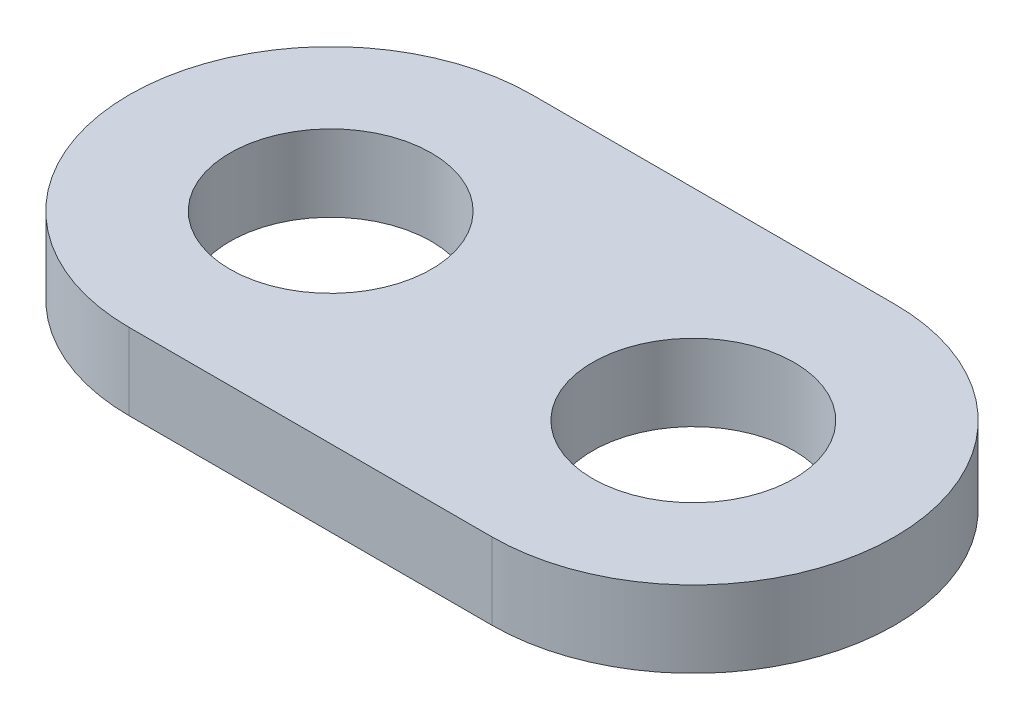
ISO-10303-21;
HEADER;
FILE_DESCRIPTION(('STEP AP214'),'2;1');
FILE_NAME('part.step','',(''),(''),'','','');
FILE_SCHEMA(('AUTOMOTIVE_DESIGN { 1 0 10303 214 1 1 1 1 }'));
ENDSEC;
DATA;
#1=APPLICATION_CONTEXT('core data for automotive mechanical design processes');
#2=APPLICATION_PROTOCOL_DEFINITION('international standard','automotive_design',2000,#1);
#3=PRODUCT_CONTEXT('',#1,'mechanical');
#4=PRODUCT('Part','Part','',(#3));
#5=PRODUCT_RELATED_PRODUCT_CATEGORY('part','',(#4));
#6=PRODUCT_DEFINITION_FORMATION('','',#4);
#7=PRODUCT_DEFINITION_CONTEXT('part definition',#1,'design');
#8=PRODUCT_DEFINITION('design','',#6,#7);
#9=PRODUCT_DEFINITION_SHAPE('','',#8);
#10=(LENGTH_UNIT() NAMED_UNIT(*) SI_UNIT(.MILLI.,.METRE.));
#11=(NAMED_UNIT(*) PLANE_ANGLE_UNIT() SI_UNIT($,.RADIAN.));
#12=(NAMED_UNIT(*) SI_UNIT($,.STERADIAN.) SOLID_ANGLE_UNIT());
#13=UNCERTAINTY_MEASURE_WITH_UNIT(LENGTH_MEASURE(1.E-05),#10,'distance_accuracy_value','');
#14=(GEOMETRIC_REPRESENTATION_CONTEXT(3) GLOBAL_UNCERTAINTY_ASSIGNED_CONTEXT((#13)) GLOBAL_UNIT_ASSIGNED_CONTEXT((#10,
#11,#12)) REPRESENTATION_CONTEXT('',''));
#15=CARTESIAN_POINT('',(0.,0.,0.));
#16=DIRECTION('',(0.,0.,1.));
#17=DIRECTION('',(1.,0.,0.));
#18=AXIS2_PLACEMENT_3D('',#15,#16,#17);
#19=CARTESIAN_POINT('',(0.,2.413,0.));
#20=DIRECTION('',(0.,1.,0.));
#21=DIRECTION('',(0.,0.,1.));
#22=AXIS2_PLACEMENT_3D('',#19,#20,#21);
#23=PLANE('',#22);
#24=CARTESIAN_POINT('',(0.,2.413,0.));
#25=DIRECTION('',(0.,1.,0.));
#26=DIRECTION('',(0.,0.,1.));
#27=AXIS2_PLACEMENT_3D('',#24,#25,#26);
#28=CIRCLE('',#27,3.175);
#29=CARTESIAN_POINT('',(0.,2.413,3.175));
#30=VERTEX_POINT('',#29);
#31=EDGE_CURVE('E112',#30,#30,#28,.T.);
#32=ORIENTED_EDGE('',*,*,#31,.F.);
#33=EDGE_LOOP('',(#32));
#34=FACE_BOUND('',#33,.T.);
#35=CARTESIAN_POINT('',(0.,2.413,0.));
#36=DIRECTION('',(0.,1.,0.));
#37=DIRECTION('',(0.,0.,1.));
#38=AXIS2_PLACEMENT_3D('',#35,#36,#37);
#39=CIRCLE('',#38,6.35);
#40=CARTESIAN_POINT('',(0.,2.413,-6.35));
#41=VERTEX_POINT('',#40);
#42=CARTESIAN_POINT('',(0.,2.413,6.35));
#43=VERTEX_POINT('',#42);
#44=EDGE_CURVE('E92',#41,#43,#39,.T.);
#45=ORIENTED_EDGE('',*,*,#44,.T.);
#46=DIRECTION('',(1.,0.,0.));
#47=VECTOR('',#46,1.);
#48=CARTESIAN_POINT('',(0.,2.413,6.35));
#49=LINE('',#48,#47);
#50=CARTESIAN_POINT('',(11.43,2.413,6.35));
#51=VERTEX_POINT('',#50);
#52=EDGE_CURVE('E87',#43,#51,#49,.T.);
#53=ORIENTED_EDGE('',*,*,#52,.T.);
#54=CARTESIAN_POINT('',(11.43,2.413,0.));
#55=DIRECTION('',(0.,1.,0.));
#56=DIRECTION('',(0.,0.,1.));
#57=AXIS2_PLACEMENT_3D('',#54,#55,#56);
#58=CIRCLE('',#57,6.35);
#59=CARTESIAN_POINT('',(11.43,2.413,-6.35));
#60=VERTEX_POINT('',#59);
#61=EDGE_CURVE('E90',#51,#60,#58,.T.);
#62=ORIENTED_EDGE('',*,*,#61,.T.);
#63=DIRECTION('',(-1.,0.,0.));
#64=VECTOR('',#63,1.);
#65=CARTESIAN_POINT('',(0.,2.413,-6.35));
#66=LINE('',#65,#64);
#67=EDGE_CURVE('E57',#60,#41,#66,.T.);
#68=ORIENTED_EDGE('',*,*,#67,.T.);
#69=EDGE_LOOP('',(#45,#53,#62,#68));
#70=FACE_BOUND('',#69,.T.);
#71=CARTESIAN_POINT('',(11.43,2.413,0.));
#72=DIRECTION('',(0.,1.,0.));
#73=DIRECTION('',(0.,0.,1.));
#74=AXIS2_PLACEMENT_3D('',#71,#72,#73);
#75=CIRCLE('',#74,3.175);
#76=CARTESIAN_POINT('',(11.43,2.413,3.175));
#77=VERTEX_POINT('',#76);
#78=EDGE_CURVE('E134',#77,#77,#75,.T.);
#79=ORIENTED_EDGE('',*,*,#78,.F.);
#80=EDGE_LOOP('',(#79));
#81=FACE_BOUND('',#80,.T.);
#82=ADVANCED_FACE('F39',(#34,#70,#81),#23,.T.);
#83=CARTESIAN_POINT('',(0.,0.,0.));
#84=DIRECTION('',(0.,1.,0.));
#85=DIRECTION('',(0.,0.,1.));
#86=AXIS2_PLACEMENT_3D('',#83,#84,#85);
#87=PLANE('',#86);
#88=CARTESIAN_POINT('',(0.,0.,0.));
#89=DIRECTION('',(0.,1.,0.));
#90=DIRECTION('',(0.,0.,1.));
#91=AXIS2_PLACEMENT_3D('',#88,#89,#90);
#92=CIRCLE('',#91,6.35);
#93=CARTESIAN_POINT('',(0.,0.,-6.35));
#94=VERTEX_POINT('',#93);
#95=CARTESIAN_POINT('',(0.,0.,6.35));
#96=VERTEX_POINT('',#95);
#97=EDGE_CURVE('E108',#94,#96,#92,.T.);
#98=ORIENTED_EDGE('',*,*,#97,.F.);
#99=DIRECTION('',(-1.,0.,0.));
#100=VECTOR('',#99,1.);
#101=CARTESIAN_POINT('',(0.,0.,-6.35));
#102=LINE('',#101,#100);
#103=CARTESIAN_POINT('',(11.43,0.,-6.35));
#104=VERTEX_POINT('',#103);
#105=EDGE_CURVE('E80',#104,#94,#102,.T.);
#106=ORIENTED_EDGE('',*,*,#105,.F.);
#107=CARTESIAN_POINT('',(11.43,0.,0.));
#108=DIRECTION('',(0.,1.,0.));
#109=DIRECTION('',(0.,0.,1.));
#110=AXIS2_PLACEMENT_3D('',#107,#108,#109);
#111=CIRCLE('',#110,6.35);
#112=CARTESIAN_POINT('',(11.43,0.,6.35));
#113=VERTEX_POINT('',#112);
#114=EDGE_CURVE('E74',#113,#104,#111,.T.);
#115=ORIENTED_EDGE('',*,*,#114,.F.);
#116=DIRECTION('',(1.,0.,0.));
#117=VECTOR('',#116,1.);
#118=CARTESIAN_POINT('',(0.,0.,6.35));
#119=LINE('',#118,#117);
#120=EDGE_CURVE('E97',#96,#113,#119,.T.);
#121=ORIENTED_EDGE('',*,*,#120,.F.);
#122=EDGE_LOOP('',(#98,#106,#115,#121));
#123=FACE_BOUND('',#122,.T.);
#124=CARTESIAN_POINT('',(0.,0.,0.));
#125=DIRECTION('',(0.,1.,0.));
#126=DIRECTION('',(0.,0.,1.));
#127=AXIS2_PLACEMENT_3D('',#124,#125,#126);
#128=CIRCLE('',#127,3.175);
#129=CARTESIAN_POINT('',(0.,0.,3.175));
#130=VERTEX_POINT('',#129);
#131=EDGE_CURVE('E130',#130,#130,#128,.T.);
#132=ORIENTED_EDGE('',*,*,#131,.T.);
#133=EDGE_LOOP('',(#132));
#134=FACE_BOUND('',#133,.T.);
#135=CARTESIAN_POINT('',(11.43,0.,0.));
#136=DIRECTION('',(0.,1.,0.));
#137=DIRECTION('',(0.,0.,1.));
#138=AXIS2_PLACEMENT_3D('',#135,#136,#137);
#139=CIRCLE('',#138,3.175);
#140=CARTESIAN_POINT('',(11.43,0.,3.175));
#141=VERTEX_POINT('',#140);
#142=EDGE_CURVE('E138',#141,#141,#139,.T.);
#143=ORIENTED_EDGE('',*,*,#142,.T.);
#144=EDGE_LOOP('',(#143));
#145=FACE_BOUND('',#144,.T.);
#146=ADVANCED_FACE('F125',(#123,#134,#145),#87,.F.);
#147=CARTESIAN_POINT('',(0.,2.413,0.));
#148=DIRECTION('',(0.,-1.,0.));
#149=DIRECTION('',(0.,0.,-1.));
#150=AXIS2_PLACEMENT_3D('',#147,#148,#149);
#151=CYLINDRICAL_SURFACE('',#150,6.35);
#152=ORIENTED_EDGE('',*,*,#97,.T.);
#153=DIRECTION('',(0.,-1.,0.));
#154=VECTOR('',#153,1.);
#155=CARTESIAN_POINT('',(0.,2.413,6.35));
#156=LINE('',#155,#154);
#157=EDGE_CURVE('E11',#43,#96,#156,.T.);
#158=ORIENTED_EDGE('',*,*,#157,.F.);
#159=ORIENTED_EDGE('',*,*,#44,.F.);
#160=DIRECTION('',(0.,-1.,0.));
#161=VECTOR('',#160,1.);
#162=CARTESIAN_POINT('',(0.,2.413,-6.35));
#163=LINE('',#162,#161);
#164=EDGE_CURVE('E104',#41,#94,#163,.T.);
#165=ORIENTED_EDGE('',*,*,#164,.T.);
#166=EDGE_LOOP('',(#152,#158,#159,#165));
#167=FACE_BOUND('',#166,.T.);
#168=ADVANCED_FACE('F41',(#167),#151,.T.);
#169=CARTESIAN_POINT('',(0.,2.413,6.35));
#170=DIRECTION('',(0.,0.,-1.));
#171=DIRECTION('',(-1.,0.,0.));
#172=AXIS2_PLACEMENT_3D('',#169,#170,#171);
#173=PLANE('',#172);
#174=ORIENTED_EDGE('',*,*,#120,.T.);
#175=DIRECTION('',(0.,-1.,0.));
#176=VECTOR('',#175,1.);
#177=CARTESIAN_POINT('',(11.43,2.413,6.35));
#178=LINE('',#177,#176);
#179=EDGE_CURVE('E49',#51,#113,#178,.T.);
#180=ORIENTED_EDGE('',*,*,#179,.F.);
#181=ORIENTED_EDGE('',*,*,#52,.F.);
#182=ORIENTED_EDGE('',*,*,#157,.T.);
#183=EDGE_LOOP('',(#174,#180,#181,#182));
#184=FACE_BOUND('',#183,.T.);
#185=ADVANCED_FACE('F96',(#184),#173,.F.);
#186=CARTESIAN_POINT('',(11.43,2.413,0.));
#187=DIRECTION('',(0.,-1.,0.));
#188=DIRECTION('',(0.,0.,-1.));
#189=AXIS2_PLACEMENT_3D('',#186,#187,#188);
#190=CYLINDRICAL_SURFACE('',#189,6.35);
#191=ORIENTED_EDGE('',*,*,#114,.T.);
#192=DIRECTION('',(0.,-1.,0.));
#193=VECTOR('',#192,1.);
#194=CARTESIAN_POINT('',(11.43,2.413,-6.35));
#195=LINE('',#194,#193);
#196=EDGE_CURVE('E99',#60,#104,#195,.T.);
#197=ORIENTED_EDGE('',*,*,#196,.F.);
#198=ORIENTED_EDGE('',*,*,#61,.F.);
#199=ORIENTED_EDGE('',*,*,#179,.T.);
#200=EDGE_LOOP('',(#191,#197,#198,#199));
#201=FACE_BOUND('',#200,.T.);
#202=ADVANCED_FACE('F100',(#201),#190,.T.);
#203=CARTESIAN_POINT('',(0.,2.413,-6.35));
#204=DIRECTION('',(0.,0.,1.));
#205=DIRECTION('',(1.,0.,0.));
#206=AXIS2_PLACEMENT_3D('',#203,#204,#205);
#207=PLANE('',#206);
#208=ORIENTED_EDGE('',*,*,#105,.T.);
#209=ORIENTED_EDGE('',*,*,#164,.F.);
#210=ORIENTED_EDGE('',*,*,#67,.F.);
#211=ORIENTED_EDGE('',*,*,#196,.T.);
#212=EDGE_LOOP('',(#208,#209,#210,#211));
#213=FACE_BOUND('',#212,.T.);
#214=ADVANCED_FACE('F122',(#213),#207,.F.);
#215=CARTESIAN_POINT('',(0.,2.413,0.));
#216=DIRECTION('',(0.,-1.,0.));
#217=DIRECTION('',(0.,0.,-1.));
#218=AXIS2_PLACEMENT_3D('',#215,#216,#217);
#219=CYLINDRICAL_SURFACE('',#218,3.175);
#220=ORIENTED_EDGE('',*,*,#31,.T.);
#221=EDGE_LOOP('',(#220));
#222=FACE_BOUND('',#221,.T.);
#223=ORIENTED_EDGE('',*,*,#131,.F.);
#224=EDGE_LOOP('',(#223));
#225=FACE_BOUND('',#224,.T.);
#226=ADVANCED_FACE('F157',(#222,#225),#219,.F.);
#227=CARTESIAN_POINT('',(11.43,2.413,0.));
#228=DIRECTION('',(0.,-1.,0.));
#229=DIRECTION('',(0.,0.,-1.));
#230=AXIS2_PLACEMENT_3D('',#227,#228,#229);
#231=CYLINDRICAL_SURFACE('',#230,3.175);
#232=ORIENTED_EDGE('',*,*,#78,.T.);
#233=EDGE_LOOP('',(#232));
#234=FACE_BOUND('',#233,.T.);
#235=ORIENTED_EDGE('',*,*,#142,.F.);
#236=EDGE_LOOP('',(#235));
#237=FACE_BOUND('',#236,.T.);
#238=ADVANCED_FACE('F146',(#234,#237),#231,.F.);
#239=CLOSED_SHELL('',(#82,#146,#168,#185,#202,#214,#226,#238));
#240=MANIFOLD_SOLID_BREP('B2',#239);
#241=ADVANCED_BREP_SHAPE_REPRESENTATION('',(#18,#240),#14);
#242=SHAPE_DEFINITION_REPRESENTATION(#9,#241);
ENDSEC;
END-ISO-10303-21;
